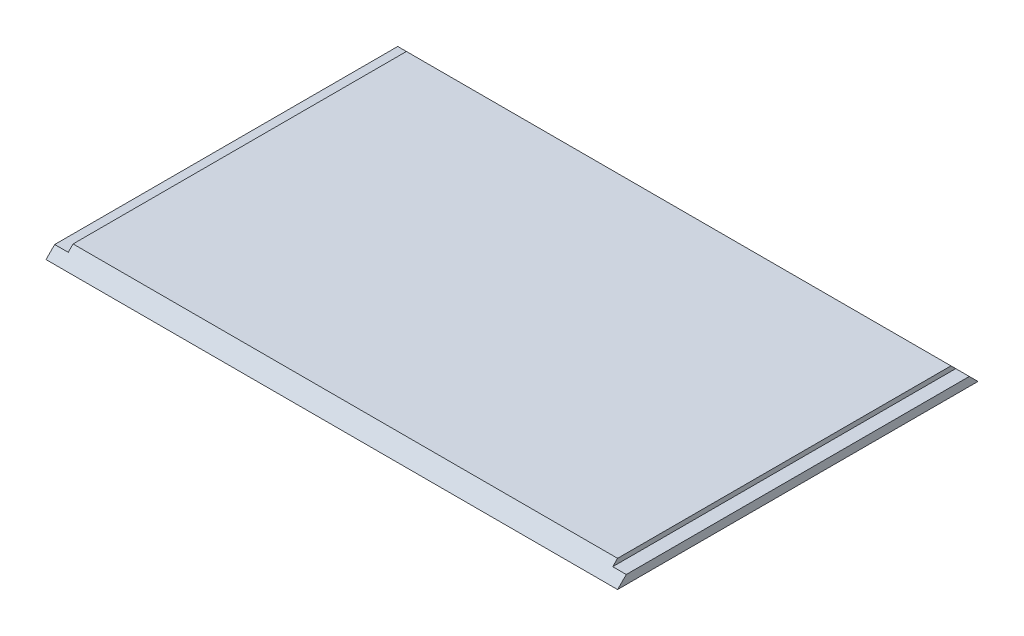
ISO-10303-21;
HEADER;
FILE_DESCRIPTION(('STEP AP214'),'2;1');
FILE_NAME('part.step','',(''),(''),'','','');
FILE_SCHEMA(('AUTOMOTIVE_DESIGN { 1 0 10303 214 1 1 1 1 }'));
ENDSEC;
DATA;
#1=APPLICATION_CONTEXT('core data for automotive mechanical design processes');
#2=APPLICATION_PROTOCOL_DEFINITION('international standard','automotive_design',2000,#1);
#3=PRODUCT_CONTEXT('',#1,'mechanical');
#4=PRODUCT('Part','Part','',(#3));
#5=PRODUCT_RELATED_PRODUCT_CATEGORY('part','',(#4));
#6=PRODUCT_DEFINITION_FORMATION('','',#4);
#7=PRODUCT_DEFINITION_CONTEXT('part definition',#1,'design');
#8=PRODUCT_DEFINITION('design','',#6,#7);
#9=PRODUCT_DEFINITION_SHAPE('','',#8);
#10=(LENGTH_UNIT() NAMED_UNIT(*) SI_UNIT(.MILLI.,.METRE.));
#11=(NAMED_UNIT(*) PLANE_ANGLE_UNIT() SI_UNIT($,.RADIAN.));
#12=(NAMED_UNIT(*) SI_UNIT($,.STERADIAN.) SOLID_ANGLE_UNIT());
#13=UNCERTAINTY_MEASURE_WITH_UNIT(LENGTH_MEASURE(1.E-05),#10,'distance_accuracy_value','');
#14=(GEOMETRIC_REPRESENTATION_CONTEXT(3) GLOBAL_UNCERTAINTY_ASSIGNED_CONTEXT((#13)) GLOBAL_UNIT_ASSIGNED_CONTEXT((#10,
#11,#12)) REPRESENTATION_CONTEXT('',''));
#15=CARTESIAN_POINT('',(0.,0.,0.));
#16=DIRECTION('',(0.,0.,1.));
#17=DIRECTION('',(1.,0.,0.));
#18=AXIS2_PLACEMENT_3D('',#15,#16,#17);
#19=CARTESIAN_POINT('',(-52.0051485148515,2.8,-22.6058415841583));
#20=DIRECTION('',(1.,0.,0.));
#21=DIRECTION('',(0.,0.,-1.));
#22=AXIS2_PLACEMENT_3D('',#19,#20,#21);
#23=PLANE('',#22);
#24=DIRECTION('',(0.,0.,1.));
#25=VECTOR('',#24,1.);
#26=CARTESIAN_POINT('',(-52.0051485148515,1.8,-22.6058415841583));
#27=LINE('',#26,#25);
#28=CARTESIAN_POINT('',(-52.0051485148515,1.8,-20.8058415841583));
#29=VERTEX_POINT('',#28);
#30=CARTESIAN_POINT('',(-52.0051485148515,1.8,50.1941584158417));
#31=VERTEX_POINT('',#30);
#32=EDGE_CURVE('E112',#29,#31,#27,.T.);
#33=ORIENTED_EDGE('',*,*,#32,.F.);
#34=DIRECTION('',(0.,-0.707106781186551,-0.707106781186544));
#35=VECTOR('',#34,1.);
#36=CARTESIAN_POINT('',(-52.0051485148515,0.,-22.6058415841583));
#37=LINE('',#36,#35);
#38=CARTESIAN_POINT('',(-52.0051485148515,0.,-22.6058415841583));
#39=VERTEX_POINT('',#38);
#40=EDGE_CURVE('E48',#29,#39,#37,.T.);
#41=ORIENTED_EDGE('',*,*,#40,.T.);
#42=DIRECTION('',(0.,0.,1.));
#43=VECTOR('',#42,1.);
#44=CARTESIAN_POINT('',(-52.0051485148515,0.,-22.6058415841583));
#45=LINE('',#44,#43);
#46=CARTESIAN_POINT('',(-52.0051485148515,0.,51.9941584158417));
#47=VERTEX_POINT('',#46);
#48=EDGE_CURVE('E111',#39,#47,#45,.T.);
#49=ORIENTED_EDGE('',*,*,#48,.T.);
#50=DIRECTION('',(0.,0.707106781186551,-0.707106781186544));
#51=VECTOR('',#50,1.);
#52=CARTESIAN_POINT('',(-52.0051485148515,0.,51.9941584158417));
#53=LINE('',#52,#51);
#54=EDGE_CURVE('E127',#47,#31,#53,.T.);
#55=ORIENTED_EDGE('',*,*,#54,.T.);
#56=EDGE_LOOP('',(#33,#41,#49,#55));
#57=FACE_BOUND('',#56,.T.);
#58=ADVANCED_FACE('F35',(#57),#23,.F.);
#59=CARTESIAN_POINT('',(66.2948514851485,2.8,-22.6058415841583));
#60=DIRECTION('',(-1.,0.,0.));
#61=DIRECTION('',(0.,0.,1.));
#62=AXIS2_PLACEMENT_3D('',#59,#60,#61);
#63=PLANE('',#62);
#64=DIRECTION('',(0.,0.,-1.));
#65=VECTOR('',#64,1.);
#66=CARTESIAN_POINT('',(66.2948514851485,0.,-22.6058415841583));
#67=LINE('',#66,#65);
#68=CARTESIAN_POINT('',(66.2948514851485,0.,51.9941584158417));
#69=VERTEX_POINT('',#68);
#70=CARTESIAN_POINT('',(66.2948514851485,0.,-22.6058415841583));
#71=VERTEX_POINT('',#70);
#72=EDGE_CURVE('E105',#69,#71,#67,.T.);
#73=ORIENTED_EDGE('',*,*,#72,.T.);
#74=DIRECTION('',(0.,-0.707106781186551,-0.707106781186544));
#75=VECTOR('',#74,1.);
#76=CARTESIAN_POINT('',(66.2948514851485,0.,-22.6058415841583));
#77=LINE('',#76,#75);
#78=CARTESIAN_POINT('',(66.2948514851485,1.8,-20.8058415841583));
#79=VERTEX_POINT('',#78);
#80=EDGE_CURVE('E100',#79,#71,#77,.T.);
#81=ORIENTED_EDGE('',*,*,#80,.F.);
#82=DIRECTION('',(0.,0.,-1.));
#83=VECTOR('',#82,1.);
#84=CARTESIAN_POINT('',(66.2948514851485,1.8,-22.6058415841583));
#85=LINE('',#84,#83);
#86=CARTESIAN_POINT('',(66.2948514851485,1.8,50.1941584158417));
#87=VERTEX_POINT('',#86);
#88=EDGE_CURVE('E121',#87,#79,#85,.T.);
#89=ORIENTED_EDGE('',*,*,#88,.F.);
#90=DIRECTION('',(0.,0.707106781186551,-0.707106781186544));
#91=VECTOR('',#90,1.);
#92=CARTESIAN_POINT('',(66.2948514851485,0.,51.9941584158417));
#93=LINE('',#92,#91);
#94=EDGE_CURVE('E132',#69,#87,#93,.T.);
#95=ORIENTED_EDGE('',*,*,#94,.F.);
#96=EDGE_LOOP('',(#73,#81,#89,#95));
#97=FACE_BOUND('',#96,.T.);
#98=ADVANCED_FACE('F180',(#97),#63,.F.);
#99=CARTESIAN_POINT('',(0.,2.8,0.));
#100=DIRECTION('',(0.,1.,0.));
#101=DIRECTION('',(0.,0.,1.));
#102=AXIS2_PLACEMENT_3D('',#99,#100,#101);
#103=PLANE('',#102);
#104=DIRECTION('',(1.,0.,0.));
#105=VECTOR('',#104,1.);
#106=CARTESIAN_POINT('',(-52.0051485148515,2.8,-19.8058415841584));
#107=LINE('',#106,#105);
#108=CARTESIAN_POINT('',(-49.2051485148515,2.8,-19.8058415841584));
#109=VERTEX_POINT('',#108);
#110=CARTESIAN_POINT('',(63.4948514851485,2.8,-19.8058415841584));
#111=VERTEX_POINT('',#110);
#112=EDGE_CURVE('E113',#109,#111,#107,.T.);
#113=ORIENTED_EDGE('',*,*,#112,.F.);
#114=DIRECTION('',(0.,0.,-1.));
#115=VECTOR('',#114,1.);
#116=CARTESIAN_POINT('',(-49.2051485148515,2.8,-22.6058415841583));
#117=LINE('',#116,#115);
#118=CARTESIAN_POINT('',(-49.2051485148515,2.8,49.1941584158417));
#119=VERTEX_POINT('',#118);
#120=EDGE_CURVE('E148',#119,#109,#117,.T.);
#121=ORIENTED_EDGE('',*,*,#120,.F.);
#122=DIRECTION('',(1.,0.,0.));
#123=VECTOR('',#122,1.);
#124=CARTESIAN_POINT('',(-52.0051485148515,2.8,49.1941584158417));
#125=LINE('',#124,#123);
#126=CARTESIAN_POINT('',(63.4948514851485,2.8,49.1941584158417));
#127=VERTEX_POINT('',#126);
#128=EDGE_CURVE('E131',#119,#127,#125,.T.);
#129=ORIENTED_EDGE('',*,*,#128,.T.);
#130=DIRECTION('',(0.,0.,1.));
#131=VECTOR('',#130,1.);
#132=CARTESIAN_POINT('',(63.4948514851485,2.8,-22.6058415841583));
#133=LINE('',#132,#131);
#134=EDGE_CURVE('E124',#111,#127,#133,.T.);
#135=ORIENTED_EDGE('',*,*,#134,.F.);
#136=EDGE_LOOP('',(#113,#121,#129,#135));
#137=FACE_BOUND('',#136,.T.);
#138=ADVANCED_FACE('F168',(#137),#103,.T.);
#139=CARTESIAN_POINT('',(0.,0.,0.));
#140=DIRECTION('',(0.,1.,0.));
#141=DIRECTION('',(0.,0.,1.));
#142=AXIS2_PLACEMENT_3D('',#139,#140,#141);
#143=PLANE('',#142);
#144=ORIENTED_EDGE('',*,*,#48,.F.);
#145=DIRECTION('',(-1.,0.,0.));
#146=VECTOR('',#145,1.);
#147=CARTESIAN_POINT('',(-52.0051485148515,0.,-22.6058415841583));
#148=LINE('',#147,#146);
#149=EDGE_CURVE('E97',#71,#39,#148,.T.);
#150=ORIENTED_EDGE('',*,*,#149,.F.);
#151=ORIENTED_EDGE('',*,*,#72,.F.);
#152=DIRECTION('',(1.,0.,0.));
#153=VECTOR('',#152,1.);
#154=CARTESIAN_POINT('',(-52.0051485148515,0.,51.9941584158417));
#155=LINE('',#154,#153);
#156=EDGE_CURVE('E117',#47,#69,#155,.T.);
#157=ORIENTED_EDGE('',*,*,#156,.F.);
#158=EDGE_LOOP('',(#144,#150,#151,#157));
#159=FACE_BOUND('',#158,.T.);
#160=ADVANCED_FACE('F116',(#159),#143,.F.);
#161=CARTESIAN_POINT('',(63.4948514851485,1.8,-22.6058415841583));
#162=DIRECTION('',(-1.,0.,0.));
#163=DIRECTION('',(0.,0.,1.));
#164=AXIS2_PLACEMENT_3D('',#161,#162,#163);
#165=PLANE('',#164);
#166=DIRECTION('',(0.,0.,1.));
#167=VECTOR('',#166,1.);
#168=CARTESIAN_POINT('',(63.4948514851485,1.8,-22.6058415841583));
#169=LINE('',#168,#167);
#170=CARTESIAN_POINT('',(63.4948514851485,1.8,-20.8058415841583));
#171=VERTEX_POINT('',#170);
#172=CARTESIAN_POINT('',(63.4948514851485,1.8,50.1941584158417));
#173=VERTEX_POINT('',#172);
#174=EDGE_CURVE('E118',#171,#173,#169,.T.);
#175=ORIENTED_EDGE('',*,*,#174,.F.);
#176=DIRECTION('',(0.,0.707106781186551,0.707106781186544));
#177=VECTOR('',#176,1.);
#178=CARTESIAN_POINT('',(63.4948514851485,0.900000000000009,-21.7058415841583));
#179=LINE('',#178,#177);
#180=EDGE_CURVE('E136',#171,#111,#179,.T.);
#181=ORIENTED_EDGE('',*,*,#180,.T.);
#182=ORIENTED_EDGE('',*,*,#134,.T.);
#183=DIRECTION('',(0.,-0.707106781186551,0.707106781186544));
#184=VECTOR('',#183,1.);
#185=CARTESIAN_POINT('',(63.4948514851485,38.2,13.7941584158421));
#186=LINE('',#185,#184);
#187=EDGE_CURVE('E145',#127,#173,#186,.T.);
#188=ORIENTED_EDGE('',*,*,#187,.T.);
#189=EDGE_LOOP('',(#175,#181,#182,#188));
#190=FACE_BOUND('',#189,.T.);
#191=ADVANCED_FACE('F163',(#190),#165,.F.);
#192=CARTESIAN_POINT('',(0.,1.8,0.));
#193=DIRECTION('',(0.,-1.,0.));
#194=DIRECTION('',(0.,0.,-1.));
#195=AXIS2_PLACEMENT_3D('',#192,#193,#194);
#196=PLANE('',#195);
#197=ORIENTED_EDGE('',*,*,#88,.T.);
#198=DIRECTION('',(-1.,0.,0.));
#199=VECTOR('',#198,1.);
#200=CARTESIAN_POINT('',(0.,1.8,-20.8058415841583));
#201=LINE('',#200,#199);
#202=EDGE_CURVE('E174',#79,#171,#201,.T.);
#203=ORIENTED_EDGE('',*,*,#202,.T.);
#204=ORIENTED_EDGE('',*,*,#174,.T.);
#205=DIRECTION('',(1.,0.,0.));
#206=VECTOR('',#205,1.);
#207=CARTESIAN_POINT('',(0.,1.8,50.1941584158417));
#208=LINE('',#207,#206);
#209=EDGE_CURVE('E142',#173,#87,#208,.T.);
#210=ORIENTED_EDGE('',*,*,#209,.T.);
#211=EDGE_LOOP('',(#197,#203,#204,#210));
#212=FACE_BOUND('',#211,.T.);
#213=ADVANCED_FACE('F178',(#212),#196,.F.);
#214=CARTESIAN_POINT('',(-49.2051485148515,1.8,-22.6058415841583));
#215=DIRECTION('',(1.,0.,0.));
#216=DIRECTION('',(0.,0.,-1.));
#217=AXIS2_PLACEMENT_3D('',#214,#215,#216);
#218=PLANE('',#217);
#219=ORIENTED_EDGE('',*,*,#120,.T.);
#220=DIRECTION('',(0.,-0.707106781186551,-0.707106781186544));
#221=VECTOR('',#220,1.);
#222=CARTESIAN_POINT('',(-49.2051485148515,0.900000000000009,-21.7058415841583));
#223=LINE('',#222,#221);
#224=CARTESIAN_POINT('',(-49.2051485148515,1.8,-20.8058415841583));
#225=VERTEX_POINT('',#224);
#226=EDGE_CURVE('E172',#109,#225,#223,.T.);
#227=ORIENTED_EDGE('',*,*,#226,.T.);
#228=DIRECTION('',(0.,0.,-1.));
#229=VECTOR('',#228,1.);
#230=CARTESIAN_POINT('',(-49.2051485148515,1.8,-22.6058415841583));
#231=LINE('',#230,#229);
#232=CARTESIAN_POINT('',(-49.2051485148515,1.8,50.1941584158417));
#233=VERTEX_POINT('',#232);
#234=EDGE_CURVE('E150',#233,#225,#231,.T.);
#235=ORIENTED_EDGE('',*,*,#234,.F.);
#236=DIRECTION('',(0.,0.707106781186551,-0.707106781186544));
#237=VECTOR('',#236,1.);
#238=CARTESIAN_POINT('',(-49.2051485148515,38.2,13.7941584158421));
#239=LINE('',#238,#237);
#240=EDGE_CURVE('E56',#233,#119,#239,.T.);
#241=ORIENTED_EDGE('',*,*,#240,.T.);
#242=EDGE_LOOP('',(#219,#227,#235,#241));
#243=FACE_BOUND('',#242,.T.);
#244=ADVANCED_FACE('F171',(#243),#218,.F.);
#245=CARTESIAN_POINT('',(0.,1.8,0.));
#246=DIRECTION('',(0.,1.,0.));
#247=DIRECTION('',(0.,0.,1.));
#248=AXIS2_PLACEMENT_3D('',#245,#246,#247);
#249=PLANE('',#248);
#250=DIRECTION('',(1.,0.,0.));
#251=VECTOR('',#250,1.);
#252=CARTESIAN_POINT('',(0.,1.8,-20.8058415841583));
#253=LINE('',#252,#251);
#254=EDGE_CURVE('E11',#29,#225,#253,.T.);
#255=ORIENTED_EDGE('',*,*,#254,.F.);
#256=ORIENTED_EDGE('',*,*,#32,.T.);
#257=DIRECTION('',(-1.,0.,0.));
#258=VECTOR('',#257,1.);
#259=CARTESIAN_POINT('',(0.,1.8,50.1941584158417));
#260=LINE('',#259,#258);
#261=EDGE_CURVE('E42',#233,#31,#260,.T.);
#262=ORIENTED_EDGE('',*,*,#261,.F.);
#263=ORIENTED_EDGE('',*,*,#234,.T.);
#264=EDGE_LOOP('',(#255,#256,#262,#263));
#265=FACE_BOUND('',#264,.T.);
#266=ADVANCED_FACE('F173',(#265),#249,.T.);
#267=CARTESIAN_POINT('',(-52.0051485148515,0.,51.9941584158417));
#268=DIRECTION('',(0.,-0.707106781186544,-0.707106781186551));
#269=DIRECTION('',(0.,0.707106781186551,-0.707106781186544));
#270=AXIS2_PLACEMENT_3D('',#267,#268,#269);
#271=PLANE('',#270);
#272=ORIENTED_EDGE('',*,*,#128,.F.);
#273=ORIENTED_EDGE('',*,*,#240,.F.);
#274=ORIENTED_EDGE('',*,*,#261,.T.);
#275=ORIENTED_EDGE('',*,*,#54,.F.);
#276=ORIENTED_EDGE('',*,*,#156,.T.);
#277=ORIENTED_EDGE('',*,*,#94,.T.);
#278=ORIENTED_EDGE('',*,*,#209,.F.);
#279=ORIENTED_EDGE('',*,*,#187,.F.);
#280=EDGE_LOOP('',(#272,#273,#274,#275,#276,#277,#278,#279));
#281=FACE_BOUND('',#280,.T.);
#282=ADVANCED_FACE('F126',(#281),#271,.F.);
#283=CARTESIAN_POINT('',(-52.0051485148515,0.,-22.6058415841583));
#284=DIRECTION('',(0.,-0.707106781186544,0.707106781186551));
#285=DIRECTION('',(0.,-0.707106781186551,-0.707106781186544));
#286=AXIS2_PLACEMENT_3D('',#283,#284,#285);
#287=PLANE('',#286);
#288=ORIENTED_EDGE('',*,*,#202,.F.);
#289=ORIENTED_EDGE('',*,*,#80,.T.);
#290=ORIENTED_EDGE('',*,*,#149,.T.);
#291=ORIENTED_EDGE('',*,*,#40,.F.);
#292=ORIENTED_EDGE('',*,*,#254,.T.);
#293=ORIENTED_EDGE('',*,*,#226,.F.);
#294=ORIENTED_EDGE('',*,*,#112,.T.);
#295=ORIENTED_EDGE('',*,*,#180,.F.);
#296=EDGE_LOOP('',(#288,#289,#290,#291,#292,#293,#294,#295));
#297=FACE_BOUND('',#296,.T.);
#298=ADVANCED_FACE('F98',(#297),#287,.F.);
#299=CLOSED_SHELL('',(#58,#98,#138,#160,#191,#213,#244,#266,#282,#298));
#300=MANIFOLD_SOLID_BREP('B2',#299);
#301=ADVANCED_BREP_SHAPE_REPRESENTATION('',(#18,#300),#14);
#302=SHAPE_DEFINITION_REPRESENTATION(#9,#301);
ENDSEC;
END-ISO-10303-21;
